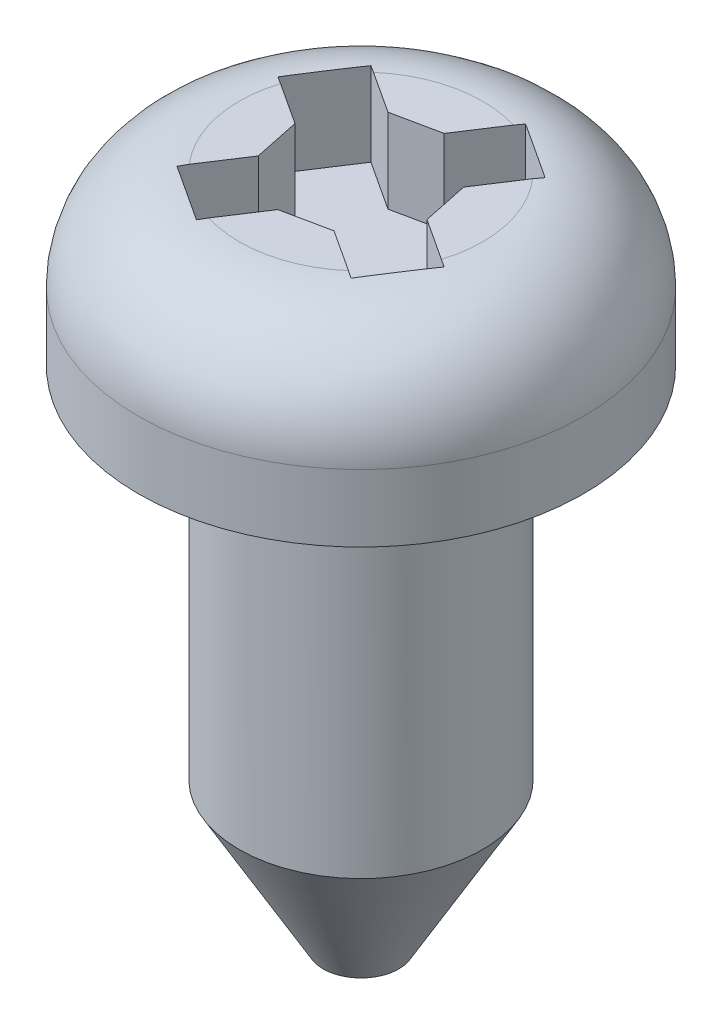
ISO-10303-21;
HEADER;
FILE_DESCRIPTION(('STEP AP214'),'2;1');
FILE_NAME('part.step','',(''),(''),'','','');
FILE_SCHEMA(('AUTOMOTIVE_DESIGN { 1 0 10303 214 1 1 1 1 }'));
ENDSEC;
DATA;
#1=APPLICATION_CONTEXT('core data for automotive mechanical design processes');
#2=APPLICATION_PROTOCOL_DEFINITION('international standard','automotive_design',2000,#1);
#3=PRODUCT_CONTEXT('',#1,'mechanical');
#4=PRODUCT('Part','Part','',(#3));
#5=PRODUCT_RELATED_PRODUCT_CATEGORY('part','',(#4));
#6=PRODUCT_DEFINITION_FORMATION('','',#4);
#7=PRODUCT_DEFINITION_CONTEXT('part definition',#1,'design');
#8=PRODUCT_DEFINITION('design','',#6,#7);
#9=PRODUCT_DEFINITION_SHAPE('','',#8);
#10=(LENGTH_UNIT() NAMED_UNIT(*) SI_UNIT(.MILLI.,.METRE.));
#11=(NAMED_UNIT(*) PLANE_ANGLE_UNIT() SI_UNIT($,.RADIAN.));
#12=(NAMED_UNIT(*) SI_UNIT($,.STERADIAN.) SOLID_ANGLE_UNIT());
#13=UNCERTAINTY_MEASURE_WITH_UNIT(LENGTH_MEASURE(1.E-05),#10,'distance_accuracy_value','');
#14=(GEOMETRIC_REPRESENTATION_CONTEXT(3) GLOBAL_UNCERTAINTY_ASSIGNED_CONTEXT((#13)) GLOBAL_UNIT_ASSIGNED_CONTEXT((#10,
#11,#12)) REPRESENTATION_CONTEXT('',''));
#15=CARTESIAN_POINT('',(0.,0.,0.));
#16=DIRECTION('',(0.,0.,1.));
#17=DIRECTION('',(1.,0.,0.));
#18=AXIS2_PLACEMENT_3D('',#15,#16,#17);
#19=CARTESIAN_POINT('',(-25.3042072060542,9.29457308248913,-5.11148706109274));
#20=DIRECTION('',(0.20522004133536,0.,0.978715860009591));
#21=DIRECTION('',(0.978715860009591,0.,-0.20522004133536));
#22=AXIS2_PLACEMENT_3D('',#19,#20,#21);
#23=PLANE('',#22);
#24=DIRECTION('',(0.,1.,0.));
#25=VECTOR('',#24,1.);
#26=CARTESIAN_POINT('',(-24.75056190888,9.29457308248913,-5.22757704738368));
#27=LINE('',#26,#25);
#28=CARTESIAN_POINT('',(-24.75056190888,10.2945730824891,-5.22757704738371));
#29=VERTEX_POINT('',#28);
#30=CARTESIAN_POINT('',(-24.75056190888,9.29457308248913,-5.22757704738367));
#31=VERTEX_POINT('',#30);
#32=EDGE_CURVE('E557',#29,#31,#27,.F.);
#33=ORIENTED_EDGE('',*,*,#32,.T.);
#34=DIRECTION('',(-0.978715860009593,0.,0.205220041335349));
#35=VECTOR('',#34,1.);
#36=CARTESIAN_POINT('',(-24.75056190888,9.29457308248913,-5.22757704738365));
#37=LINE('',#36,#35);
#38=CARTESIAN_POINT('',(-25.3042072060543,9.29457308248913,-5.1114870610928));
#39=VERTEX_POINT('',#38);
#40=EDGE_CURVE('E555',#31,#39,#37,.T.);
#41=ORIENTED_EDGE('',*,*,#40,.T.);
#42=DIRECTION('',(0.,1.,0.));
#43=VECTOR('',#42,1.);
#44=CARTESIAN_POINT('',(-25.3042072060543,9.29457308248913,-5.11148706109283));
#45=LINE('',#44,#43);
#46=CARTESIAN_POINT('',(-25.3042072060543,10.2945730824891,-5.11148706109279));
#47=VERTEX_POINT('',#46);
#48=EDGE_CURVE('E540',#39,#47,#45,.T.);
#49=ORIENTED_EDGE('',*,*,#48,.T.);
#50=DIRECTION('',(-0.978715860009565,0.,0.205220041335485));
#51=VECTOR('',#50,1.);
#52=CARTESIAN_POINT('',(-24.75056190888,10.2945730824891,-5.22757704738373));
#53=LINE('',#52,#51);
#54=EDGE_CURVE('E547',#29,#47,#53,.T.);
#55=ORIENTED_EDGE('',*,*,#54,.F.);
#56=EDGE_LOOP('',(#33,#41,#49,#55));
#57=FACE_BOUND('',#56,.T.);
#58=ADVANCED_FACE('F17',(#57),#23,.F.);
#59=CARTESIAN_POINT('',(-25.9739424895191,9.29457308248913,-5.54904237197589));
#60=DIRECTION('',(-0.978715860009591,0.,0.20522004133536));
#61=DIRECTION('',(0.20522004133536,0.,0.978715860009591));
#62=AXIS2_PLACEMENT_3D('',#59,#60,#61);
#63=PLANE('',#62);
#64=DIRECTION('',(0.,1.,0.));
#65=VECTOR('',#64,1.);
#66=CARTESIAN_POINT('',(-25.973942489519,9.29457308248913,-5.54904237197608));
#67=LINE('',#66,#65);
#68=CARTESIAN_POINT('',(-25.9739424895189,10.2945730824891,-5.54904237197606));
#69=VERTEX_POINT('',#68);
#70=CARTESIAN_POINT('',(-25.973942489519,9.29457308248913,-5.54904237197602));
#71=VERTEX_POINT('',#70);
#72=EDGE_CURVE('E140',#69,#71,#67,.F.);
#73=ORIENTED_EDGE('',*,*,#72,.T.);
#74=DIRECTION('',(-0.205220041335355,0.,-0.978715860009592));
#75=VECTOR('',#74,1.);
#76=CARTESIAN_POINT('',(-25.9739424895191,9.29457308248913,-5.54904237197589));
#77=LINE('',#76,#75);
#78=CARTESIAN_POINT('',(-26.09003247581,9.29457308248913,-6.10268766915));
#79=VERTEX_POINT('',#78);
#80=EDGE_CURVE('E133',#71,#79,#77,.T.);
#81=ORIENTED_EDGE('',*,*,#80,.T.);
#82=DIRECTION('',(0.,1.,0.));
#83=VECTOR('',#82,1.);
#84=CARTESIAN_POINT('',(-26.09003247581,9.29457308248913,-6.10268766915));
#85=LINE('',#84,#83);
#86=CARTESIAN_POINT('',(-26.09003247581,10.2945730824891,-6.10268766915001));
#87=VERTEX_POINT('',#86);
#88=EDGE_CURVE('E476',#79,#87,#85,.T.);
#89=ORIENTED_EDGE('',*,*,#88,.T.);
#90=DIRECTION('',(-0.205220041335553,0.,-0.978715860009551));
#91=VECTOR('',#90,1.);
#92=CARTESIAN_POINT('',(-25.9739424895189,10.2945730824891,-5.54904237197605));
#93=LINE('',#92,#91);
#94=EDGE_CURVE('E642',#69,#87,#93,.T.);
#95=ORIENTED_EDGE('',*,*,#94,.F.);
#96=EDGE_LOOP('',(#73,#81,#89,#95));
#97=FACE_BOUND('',#96,.T.);
#98=ADVANCED_FACE('F239',(#97),#63,.F.);
#99=CARTESIAN_POINT('',(-25.0988318677528,9.29457308248913,-6.88851293890572));
#100=DIRECTION('',(-0.20522004133536,0.,-0.978715860009591));
#101=DIRECTION('',(-0.978715860009591,0.,0.20522004133536));
#102=AXIS2_PLACEMENT_3D('',#99,#100,#101);
#103=PLANE('',#102);
#104=DIRECTION('',(0.,1.,0.));
#105=VECTOR('',#104,1.);
#106=CARTESIAN_POINT('',(-25.6524771649268,9.29457308248913,-6.77242295261503));
#107=LINE('',#106,#105);
#108=CARTESIAN_POINT('',(-25.6524771649268,10.2945730824891,-6.77242295261503));
#109=VERTEX_POINT('',#108);
#110=CARTESIAN_POINT('',(-25.6524771649268,9.29457308248913,-6.77242295261503));
#111=VERTEX_POINT('',#110);
#112=EDGE_CURVE('E628',#109,#111,#107,.F.);
#113=ORIENTED_EDGE('',*,*,#112,.T.);
#114=DIRECTION('',(0.978715860009657,0.,-0.205220041335045));
#115=VECTOR('',#114,1.);
#116=CARTESIAN_POINT('',(-25.6524771649268,9.29457308248913,-6.77242295261503));
#117=LINE('',#116,#115);
#118=CARTESIAN_POINT('',(-25.0988318677527,9.29457308248913,-6.88851293890568));
#119=VERTEX_POINT('',#118);
#120=EDGE_CURVE('E598',#111,#119,#117,.T.);
#121=ORIENTED_EDGE('',*,*,#120,.T.);
#122=DIRECTION('',(0.,1.,0.));
#123=VECTOR('',#122,1.);
#124=CARTESIAN_POINT('',(-25.0988318677527,9.29457308248913,-6.88851293890567));
#125=LINE('',#124,#123);
#126=CARTESIAN_POINT('',(-25.0988318677527,10.2945730824891,-6.88851293890576));
#127=VERTEX_POINT('',#126);
#128=EDGE_CURVE('E392',#119,#127,#125,.T.);
#129=ORIENTED_EDGE('',*,*,#128,.T.);
#130=DIRECTION('',(0.978715860009579,0.,-0.205220041335414));
#131=VECTOR('',#130,1.);
#132=CARTESIAN_POINT('',(-25.6524771649268,10.2945730824891,-6.77242295261503));
#133=LINE('',#132,#131);
#134=EDGE_CURVE('E412',#109,#127,#133,.T.);
#135=ORIENTED_EDGE('',*,*,#134,.F.);
#136=EDGE_LOOP('',(#113,#121,#129,#135));
#137=FACE_BOUND('',#136,.T.);
#138=ADVANCED_FACE('F236',(#137),#103,.F.);
#139=CARTESIAN_POINT('',(-24.4290965842875,9.29457308248913,-6.45095762802289));
#140=DIRECTION('',(0.978715860009591,0.,-0.20522004133536));
#141=DIRECTION('',(-0.20522004133536,0.,-0.978715860009591));
#142=AXIS2_PLACEMENT_3D('',#139,#140,#141);
#143=PLANE('',#142);
#144=DIRECTION('',(0.,1.,0.));
#145=VECTOR('',#144,1.);
#146=CARTESIAN_POINT('',(-24.4290965842875,9.29457308248913,-6.4509576280229));
#147=LINE('',#146,#145);
#148=CARTESIAN_POINT('',(-24.4290965842875,10.2945730824891,-6.45095762802289));
#149=VERTEX_POINT('',#148);
#150=CARTESIAN_POINT('',(-24.4290965842875,9.29457308248913,-6.4509576280229));
#151=VERTEX_POINT('',#150);
#152=EDGE_CURVE('E601',#149,#151,#147,.F.);
#153=ORIENTED_EDGE('',*,*,#152,.T.);
#154=DIRECTION('',(0.205220041335026,0.,0.978715860009661));
#155=VECTOR('',#154,1.);
#156=CARTESIAN_POINT('',(-24.4290965842875,9.29457308248913,-6.45095762802289));
#157=LINE('',#156,#155);
#158=CARTESIAN_POINT('',(-24.3130065979968,9.29457308248913,-5.89731233084878));
#159=VERTEX_POINT('',#158);
#160=EDGE_CURVE('E558',#151,#159,#157,.T.);
#161=ORIENTED_EDGE('',*,*,#160,.T.);
#162=DIRECTION('',(0.,1.,0.));
#163=VECTOR('',#162,1.);
#164=CARTESIAN_POINT('',(-24.3130065979968,9.29457308248913,-5.89731233084878));
#165=LINE('',#164,#163);
#166=CARTESIAN_POINT('',(-24.3130065979968,10.2945730824891,-5.89731233084878));
#167=VERTEX_POINT('',#166);
#168=EDGE_CURVE('E593',#159,#167,#165,.T.);
#169=ORIENTED_EDGE('',*,*,#168,.T.);
#170=DIRECTION('',(0.205220041335019,0.,0.978715860009662));
#171=VECTOR('',#170,1.);
#172=CARTESIAN_POINT('',(-24.4290965842875,10.2945730824891,-6.45095762802289));
#173=LINE('',#172,#171);
#174=EDGE_CURVE('E329',#149,#167,#173,.T.);
#175=ORIENTED_EDGE('',*,*,#174,.F.);
#176=EDGE_LOOP('',(#153,#161,#169,#175));
#177=FACE_BOUND('',#176,.T.);
#178=ADVANCED_FACE('F233',(#177),#143,.F.);
#179=CARTESIAN_POINT('',(-25.0854295506126,9.29457308248913,-5.44635470282528));
#180=DIRECTION('',(0.,-1.,0.));
#181=DIRECTION('',(0.,0.,-1.));
#182=AXIS2_PLACEMENT_3D('',#179,#180,#181);
#183=PLANE('',#182);
#184=ORIENTED_EDGE('',*,*,#40,.F.);
#185=DIRECTION('',(0.837169104331223,0.,0.546944138603988));
#186=VECTOR('',#185,1.);
#187=CARTESIAN_POINT('',(-24.75056190888,9.29457308248913,-5.22757704738365));
#188=LINE('',#187,#186);
#189=CARTESIAN_POINT('',(-24.1645435358481,9.29457308248913,-4.84471615036077));
#190=VERTEX_POINT('',#189);
#191=EDGE_CURVE('E562',#31,#190,#188,.T.);
#192=ORIENTED_EDGE('',*,*,#191,.T.);
#193=DIRECTION('',(0.546944138603986,0.,-0.837169104331224));
#194=VECTOR('',#193,1.);
#195=CARTESIAN_POINT('',(-24.1645435358479,9.29457308248913,-4.84471615036108));
#196=LINE('',#195,#194);
#197=CARTESIAN_POINT('',(-23.7269882249649,9.29457308248913,-5.51445143382579));
#198=VERTEX_POINT('',#197);
#199=EDGE_CURVE('E173',#190,#198,#196,.T.);
#200=ORIENTED_EDGE('',*,*,#199,.T.);
#201=DIRECTION('',(-0.837169104331223,0.,-0.546944138603988));
#202=VECTOR('',#201,1.);
#203=CARTESIAN_POINT('',(-24.3130065979968,9.29457308248913,-5.89731233084878));
#204=LINE('',#203,#202);
#205=EDGE_CURVE('E216',#198,#159,#204,.T.);
#206=ORIENTED_EDGE('',*,*,#205,.T.);
#207=ORIENTED_EDGE('',*,*,#160,.F.);
#208=DIRECTION('',(0.546944138603991,0.,-0.837169104331221));
#209=VECTOR('',#208,1.);
#210=CARTESIAN_POINT('',(-24.0462356872648,9.29457308248913,-7.03697600105463));
#211=LINE('',#210,#209);
#212=CARTESIAN_POINT('',(-24.0462356872648,9.29457308248913,-7.0369760010546));
#213=VERTEX_POINT('',#212);
#214=EDGE_CURVE('E603',#151,#213,#211,.T.);
#215=ORIENTED_EDGE('',*,*,#214,.T.);
#216=DIRECTION('',(-0.837169104331221,0.,-0.546944138603991));
#217=VECTOR('',#216,1.);
#218=CARTESIAN_POINT('',(-24.7159709707298,9.29457308248913,-7.47453131193772));
#219=LINE('',#218,#217);
#220=CARTESIAN_POINT('',(-24.7159709707298,9.29457308248913,-7.47453131193772));
#221=VERTEX_POINT('',#220);
#222=EDGE_CURVE('E391',#213,#221,#219,.T.);
#223=ORIENTED_EDGE('',*,*,#222,.T.);
#224=DIRECTION('',(-0.54694413860399,0.,0.837169104331221));
#225=VECTOR('',#224,1.);
#226=CARTESIAN_POINT('',(-24.7159709707298,9.29457308248913,-7.47453131193772));
#227=LINE('',#226,#225);
#228=EDGE_CURVE('E613',#221,#119,#227,.T.);
#229=ORIENTED_EDGE('',*,*,#228,.T.);
#230=ORIENTED_EDGE('',*,*,#120,.F.);
#231=DIRECTION('',(-0.837169104331223,0.,-0.546944138603988));
#232=VECTOR('',#231,1.);
#233=CARTESIAN_POINT('',(-25.6524771649268,9.29457308248913,-6.77242295261503));
#234=LINE('',#233,#232);
#235=CARTESIAN_POINT('',(-26.2384955379586,9.29457308248913,-7.15528384963779));
#236=VERTEX_POINT('',#235);
#237=EDGE_CURVE('E630',#111,#236,#234,.T.);
#238=ORIENTED_EDGE('',*,*,#237,.T.);
#239=DIRECTION('',(-0.546944138603986,0.,0.837169104331224));
#240=VECTOR('',#239,1.);
#241=CARTESIAN_POINT('',(-26.6760508488417,9.29457308248913,-6.48554856617292));
#242=LINE('',#241,#240);
#243=CARTESIAN_POINT('',(-26.6760508488417,9.29457308248913,-6.48554856617287));
#244=VERTEX_POINT('',#243);
#245=EDGE_CURVE('E475',#236,#244,#242,.T.);
#246=ORIENTED_EDGE('',*,*,#245,.T.);
#247=DIRECTION('',(0.837169104331223,0.,0.546944138603988));
#248=VECTOR('',#247,1.);
#249=CARTESIAN_POINT('',(-26.09003247581,9.29457308248913,-6.10268766915));
#250=LINE('',#249,#248);
#251=EDGE_CURVE('E640',#244,#79,#250,.T.);
#252=ORIENTED_EDGE('',*,*,#251,.T.);
#253=ORIENTED_EDGE('',*,*,#80,.F.);
#254=DIRECTION('',(-0.546944138603991,0.,0.837169104331221));
#255=VECTOR('',#254,1.);
#256=CARTESIAN_POINT('',(-26.3568033865419,9.29457308248913,-4.96302399894399));
#257=LINE('',#256,#255);
#258=CARTESIAN_POINT('',(-26.3568033865419,9.29457308248913,-4.96302399894399));
#259=VERTEX_POINT('',#258);
#260=EDGE_CURVE('E516',#71,#259,#257,.T.);
#261=ORIENTED_EDGE('',*,*,#260,.T.);
#262=DIRECTION('',(0.837169104331221,0.,0.546944138603991));
#263=VECTOR('',#262,1.);
#264=CARTESIAN_POINT('',(-26.3568033865419,9.29457308248913,-4.96302399894399));
#265=LINE('',#264,#263);
#266=CARTESIAN_POINT('',(-25.6870681030771,9.29457308248913,-4.52546868806095));
#267=VERTEX_POINT('',#266);
#268=EDGE_CURVE('E520',#259,#267,#265,.T.);
#269=ORIENTED_EDGE('',*,*,#268,.T.);
#270=DIRECTION('',(0.54694413860399,0.,-0.837169104331221));
#271=VECTOR('',#270,1.);
#272=CARTESIAN_POINT('',(-25.6870681030772,9.29457308248913,-4.52546868806087));
#273=LINE('',#272,#271);
#274=EDGE_CURVE('E543',#267,#39,#273,.T.);
#275=ORIENTED_EDGE('',*,*,#274,.T.);
#276=EDGE_LOOP('',(#184,#192,#200,#206,#207,#215,#223,#229,#230,#238,#246,#252,#253,#261,#269,#275));
#277=FACE_BOUND('',#276,.T.);
#278=ADVANCED_FACE('F228',(#277),#183,.F.);
#279=CARTESIAN_POINT('',(-24.75056190888,9.29457308248913,-5.22757704738365));
#280=DIRECTION('',(-0.546944138603988,0.,0.837169104331223));
#281=DIRECTION('',(0.837169104331223,0.,0.546944138603988));
#282=AXIS2_PLACEMENT_3D('',#279,#280,#281);
#283=PLANE('',#282);
#284=DIRECTION('',(0.,1.,0.));
#285=VECTOR('',#284,1.);
#286=CARTESIAN_POINT('',(-24.1645435358481,9.29457308248913,-4.84471615036075));
#287=LINE('',#286,#285);
#288=CARTESIAN_POINT('',(-24.1645435358481,10.290194536761,-4.84471615036081));
#289=VERTEX_POINT('',#288);
#290=EDGE_CURVE('E190',#289,#190,#287,.F.);
#291=ORIENTED_EDGE('',*,*,#290,.T.);
#292=ORIENTED_EDGE('',*,*,#191,.F.);
#293=ORIENTED_EDGE('',*,*,#32,.F.);
#294=DIRECTION('',(-0.837169104331162,0.,-0.546944138604081));
#295=VECTOR('',#294,1.);
#296=CARTESIAN_POINT('',(-24.2535044848721,10.2945730824891,-4.90283662970197));
#297=LINE('',#296,#295);
#298=CARTESIAN_POINT('',(-24.2535044848721,10.2945730824891,-4.90283662970197));
#299=VERTEX_POINT('',#298);
#300=EDGE_CURVE('E198',#299,#29,#297,.T.);
#301=ORIENTED_EDGE('',*,*,#300,.F.);
#302=CARTESIAN_POINT('',(-24.1645435358482,10.290194536761,-4.84471615036087));
#303=CARTESIAN_POINT('',(-24.2088309172075,10.2945730824891,-4.87365023730133));
#304=CARTESIAN_POINT('',(-24.2535044848721,10.2945730824891,-4.90283662970197));
#305=B_SPLINE_CURVE_WITH_KNOTS('',2,(#302,#303,#304),.UNSPECIFIED.,.F.,.F.,(3,3),(0.,1.),.UNSPECIFIED.);
#306=EDGE_CURVE('E183',#289,#299,#305,.T.);
#307=ORIENTED_EDGE('',*,*,#306,.F.);
#308=EDGE_LOOP('',(#291,#292,#293,#301,#307));
#309=FACE_BOUND('',#308,.T.);
#310=ADVANCED_FACE('F196',(#309),#283,.F.);
#311=CARTESIAN_POINT('',(-25.2015195369034,10.2945730824891,-5.99999999999937));
#312=DIRECTION('',(0.,1.,0.));
#313=DIRECTION('',(0.,0.,1.));
#314=AXIS2_PLACEMENT_3D('',#311,#312,#313);
#315=PLANE('',#314);
#316=ORIENTED_EDGE('',*,*,#300,.T.);
#317=ORIENTED_EDGE('',*,*,#54,.T.);
#318=DIRECTION('',(0.54694413860399,0.,-0.837169104331221));
#319=VECTOR('',#318,1.);
#320=CARTESIAN_POINT('',(-25.6870681030772,10.2945730824891,-4.52546868806087));
#321=LINE('',#320,#319);
#322=CARTESIAN_POINT('',(-25.6289476237358,10.2945730824891,-4.61442963708493));
#323=VERTEX_POINT('',#322);
#324=EDGE_CURVE('E80',#47,#323,#321,.F.);
#325=ORIENTED_EDGE('',*,*,#324,.T.);
#326=CARTESIAN_POINT('',(-25.2015195369034,10.2945730824892,-5.99999999999937));
#327=DIRECTION('',(0.,-1.,0.));
#328=DIRECTION('',(0.653803484159476,0.,0.756664393308506));
#329=AXIS2_PLACEMENT_3D('',#326,#327,#328);
#330=CIRCLE('',#329,1.45000000000009);
#331=EDGE_CURVE('E199',#299,#323,#330,.T.);
#332=ORIENTED_EDGE('',*,*,#331,.F.);
#333=EDGE_LOOP('',(#316,#317,#325,#332));
#334=FACE_BOUND('',#333,.T.);
#335=ADVANCED_FACE('F227',(#334),#315,.T.);
#336=CARTESIAN_POINT('',(-25.6870681030772,9.29457308248913,-4.52546868806087));
#337=DIRECTION('',(0.837169104331221,0.,0.54694413860399));
#338=DIRECTION('',(0.54694413860399,0.,-0.837169104331221));
#339=AXIS2_PLACEMENT_3D('',#336,#337,#338);
#340=PLANE('',#339);
#341=ORIENTED_EDGE('',*,*,#324,.F.);
#342=ORIENTED_EDGE('',*,*,#48,.F.);
#343=ORIENTED_EDGE('',*,*,#274,.F.);
#344=DIRECTION('',(0.,1.,0.));
#345=VECTOR('',#344,1.);
#346=CARTESIAN_POINT('',(-25.6870681030771,9.29457308248913,-4.52546868806095));
#347=LINE('',#346,#345);
#348=CARTESIAN_POINT('',(-25.6870681030771,10.2901945367611,-4.52546868806095));
#349=VERTEX_POINT('',#348);
#350=EDGE_CURVE('E71',#267,#349,#347,.T.);
#351=ORIENTED_EDGE('',*,*,#350,.T.);
#352=CARTESIAN_POINT('',(-25.6289476237359,10.2945730824891,-4.61442963708504));
#353=CARTESIAN_POINT('',(-25.6581340161347,10.2945730824891,-4.56975606942327));
#354=CARTESIAN_POINT('',(-25.6870681030772,10.2901945367611,-4.52546868806087));
#355=B_SPLINE_CURVE_WITH_KNOTS('',2,(#352,#353,#354),.UNSPECIFIED.,.F.,.F.,(3,3),(0.,1.),.UNSPECIFIED.);
#356=EDGE_CURVE('E201',#323,#349,#355,.T.);
#357=ORIENTED_EDGE('',*,*,#356,.F.);
#358=EDGE_LOOP('',(#341,#342,#343,#351,#357));
#359=FACE_BOUND('',#358,.T.);
#360=ADVANCED_FACE('F526',(#359),#340,.F.);
#361=CARTESIAN_POINT('',(-26.3568033865419,9.29457308248913,-4.96302399894399));
#362=DIRECTION('',(-0.546944138603991,0.,0.837169104331221));
#363=DIRECTION('',(0.837169104331221,0.,0.546944138603991));
#364=AXIS2_PLACEMENT_3D('',#361,#362,#363);
#365=PLANE('',#364);
#366=ORIENTED_EDGE('',*,*,#350,.F.);
#367=ORIENTED_EDGE('',*,*,#268,.F.);
#368=DIRECTION('',(0.,1.,0.));
#369=VECTOR('',#368,1.);
#370=CARTESIAN_POINT('',(-26.3568033865419,9.29457308248913,-4.96302399894399));
#371=LINE('',#370,#369);
#372=CARTESIAN_POINT('',(-26.3568033865419,10.290194536761,-4.96302399894397));
#373=VERTEX_POINT('',#372);
#374=EDGE_CURVE('E509',#259,#373,#371,.T.);
#375=ORIENTED_EDGE('',*,*,#374,.T.);
#376=CARTESIAN_POINT('',(-25.6870681030771,10.2901945367611,-4.52546868806095));
#377=CARTESIAN_POINT('',(-25.7149703432695,10.2909269774353,-4.5436979402493));
#378=CARTESIAN_POINT('',(-25.7428750431685,10.2914873019811,-4.5619287994273));
#379=CARTESIAN_POINT('',(-25.7986865329913,10.2923586930538,-4.59839188325039));
#380=CARTESIAN_POINT('',(-25.8265933228405,10.2926697661586,-4.61662410784675));
#381=CARTESIAN_POINT('',(-25.9103112565686,10.2933715731058,-4.6713191902521));
#382=CARTESIAN_POINT('',(-25.9661235006891,10.2935309633173,-4.70778276687728));
#383=CARTESIAN_POINT('',(-26.07774798893,10.2935309633173,-4.78070992012765));
#384=CARTESIAN_POINT('',(-26.1335602330504,10.2933715731058,-4.81717349675283));
#385=CARTESIAN_POINT('',(-26.2172781667785,10.2926697661586,-4.87186857915818));
#386=CARTESIAN_POINT('',(-26.2451849566277,10.2923586930538,-4.89010080375454));
#387=CARTESIAN_POINT('',(-26.3009964464506,10.2914873019811,-4.92656388757764));
#388=CARTESIAN_POINT('',(-26.3289011463495,10.2909269774353,-4.94479474675564));
#389=CARTESIAN_POINT('',(-26.3568033865419,10.2901945367611,-4.96302399894399));
#390=B_SPLINE_CURVE_WITH_KNOTS('',3,(#376,#377,#378,#379,#380,#381,#382,#383,#384,#385,#386,
#387,#388,#389),.UNSPECIFIED.,.F.,.F.,(4,2,2,2,2,2,4),(0.,0.100010330135586,0.200018020854283,
0.4000207298462,0.600023438838118,0.700031129556812,0.800041459692404),.UNSPECIFIED.);
#391=EDGE_CURVE('E675',#349,#373,#390,.T.);
#392=ORIENTED_EDGE('',*,*,#391,.F.);
#393=EDGE_LOOP('',(#366,#367,#375,#392));
#394=FACE_BOUND('',#393,.T.);
#395=ADVANCED_FACE('F503',(#394),#365,.F.);
#396=CARTESIAN_POINT('',(-26.3568033865419,9.29457308248913,-4.96302399894399));
#397=DIRECTION('',(-0.837169104331221,0.,-0.546944138603991));
#398=DIRECTION('',(-0.546944138603991,0.,0.837169104331221));
#399=AXIS2_PLACEMENT_3D('',#396,#397,#398);
#400=PLANE('',#399);
#401=ORIENTED_EDGE('',*,*,#374,.F.);
#402=ORIENTED_EDGE('',*,*,#260,.F.);
#403=ORIENTED_EDGE('',*,*,#72,.F.);
#404=DIRECTION('',(0.546944138603959,0.,-0.837169104331242));
#405=VECTOR('',#404,1.);
#406=CARTESIAN_POINT('',(-26.2986829072005,10.2945730824891,-5.05198494796823));
#407=LINE('',#406,#405);
#408=CARTESIAN_POINT('',(-26.2986829072005,10.2945730824891,-5.05198494796824));
#409=VERTEX_POINT('',#408);
#410=EDGE_CURVE('E488',#409,#69,#407,.T.);
#411=ORIENTED_EDGE('',*,*,#410,.F.);
#412=CARTESIAN_POINT('',(-26.3568033865419,10.290194536761,-4.96302399894397));
#413=CARTESIAN_POINT('',(-26.3278692995994,10.2945730824891,-5.00731138030639));
#414=CARTESIAN_POINT('',(-26.2986829072006,10.2945730824891,-5.05198494796828));
#415=B_SPLINE_CURVE_WITH_KNOTS('',2,(#412,#413,#414),.UNSPECIFIED.,.F.,.F.,(3,3),(0.,1.),.UNSPECIFIED.);
#416=EDGE_CURVE('E460',#373,#409,#415,.T.);
#417=ORIENTED_EDGE('',*,*,#416,.F.);
#418=EDGE_LOOP('',(#401,#402,#403,#411,#417));
#419=FACE_BOUND('',#418,.T.);
#420=ADVANCED_FACE('F499',(#419),#400,.F.);
#421=CARTESIAN_POINT('',(-25.2015195369034,10.2945730824891,-5.99999999999937));
#422=DIRECTION('',(0.,1.,0.));
#423=DIRECTION('',(0.,0.,1.));
#424=AXIS2_PLACEMENT_3D('',#421,#422,#423);
#425=PLANE('',#424);
#426=DIRECTION('',(0.837169104331223,0.,0.546944138603988));
#427=VECTOR('',#426,1.);
#428=CARTESIAN_POINT('',(-26.09003247581,10.2945730824891,-6.10268766915));
#429=LINE('',#428,#427);
#430=CARTESIAN_POINT('',(-26.5870898998178,10.2945730824891,-6.4274280868317));
#431=VERTEX_POINT('',#430);
#432=EDGE_CURVE('E468',#87,#431,#429,.F.);
#433=ORIENTED_EDGE('',*,*,#432,.T.);
#434=CARTESIAN_POINT('',(-25.2015195369034,10.2945730824892,-5.99999999999937));
#435=DIRECTION('',(0.,-1.,0.));
#436=DIRECTION('',(-0.756664393308472,0.,0.653803484159516));
#437=AXIS2_PLACEMENT_3D('',#434,#435,#436);
#438=CIRCLE('',#437,1.44999999999976);
#439=EDGE_CURVE('E459',#409,#431,#438,.T.);
#440=ORIENTED_EDGE('',*,*,#439,.F.);
#441=ORIENTED_EDGE('',*,*,#410,.T.);
#442=ORIENTED_EDGE('',*,*,#94,.T.);
#443=EDGE_LOOP('',(#433,#440,#441,#442));
#444=FACE_BOUND('',#443,.T.);
#445=ADVANCED_FACE('F490',(#444),#425,.T.);
#446=CARTESIAN_POINT('',(-26.09003247581,9.29457308248913,-6.10268766915));
#447=DIRECTION('',(-0.546944138603988,0.,0.837169104331223));
#448=DIRECTION('',(0.837169104331223,0.,0.546944138603988));
#449=AXIS2_PLACEMENT_3D('',#446,#447,#448);
#450=PLANE('',#449);
#451=ORIENTED_EDGE('',*,*,#432,.F.);
#452=ORIENTED_EDGE('',*,*,#88,.F.);
#453=ORIENTED_EDGE('',*,*,#251,.F.);
#454=DIRECTION('',(0.,1.,0.));
#455=VECTOR('',#454,1.);
#456=CARTESIAN_POINT('',(-26.6760508488417,9.29457308248913,-6.48554856617292));
#457=LINE('',#456,#455);
#458=CARTESIAN_POINT('',(-26.6760508488417,10.2901945367611,-6.4855485661729));
#459=VERTEX_POINT('',#458);
#460=EDGE_CURVE('E631',#244,#459,#457,.T.);
#461=ORIENTED_EDGE('',*,*,#460,.T.);
#462=CARTESIAN_POINT('',(-26.5870898998179,10.2945730824891,-6.42742808683166));
#463=CARTESIAN_POINT('',(-26.6317634674796,10.2945730824891,-6.45661447923041));
#464=CARTESIAN_POINT('',(-26.6760508488418,10.2901945367611,-6.48554856617276));
#465=B_SPLINE_CURVE_WITH_KNOTS('',2,(#462,#463,#464),.UNSPECIFIED.,.F.,.F.,(3,3),(0.,1.),.UNSPECIFIED.);
#466=EDGE_CURVE('E455',#431,#459,#465,.T.);
#467=ORIENTED_EDGE('',*,*,#466,.F.);
#468=EDGE_LOOP('',(#451,#452,#453,#461,#467));
#469=FACE_BOUND('',#468,.T.);
#470=ADVANCED_FACE('F443',(#469),#450,.F.);
#471=CARTESIAN_POINT('',(-26.6760508488417,9.29457308248913,-6.48554856617292));
#472=DIRECTION('',(-0.837169104331224,0.,-0.546944138603986));
#473=DIRECTION('',(-0.546944138603986,0.,0.837169104331224));
#474=AXIS2_PLACEMENT_3D('',#471,#472,#473);
#475=PLANE('',#474);
#476=CARTESIAN_POINT('',(-26.6760508488417,10.2901945367611,-6.48554856617289));
#477=CARTESIAN_POINT('',(-26.6578215966534,10.2909269774353,-6.51345080636529));
#478=CARTESIAN_POINT('',(-26.6395907374754,10.2914873019811,-6.54135550626424));
#479=CARTESIAN_POINT('',(-26.6031276536523,10.2923586930538,-6.59716699608704));
#480=CARTESIAN_POINT('',(-26.5848954290559,10.2926697661586,-6.6250737859363));
#481=CARTESIAN_POINT('',(-26.5302003466505,10.2933715731058,-6.70879171966438));
#482=CARTESIAN_POINT('',(-26.4937367700254,10.2935309633173,-6.76460396378484));
#483=CARTESIAN_POINT('',(-26.420809616775,10.2935309633173,-6.87622845202578));
#484=CARTESIAN_POINT('',(-26.3843460401498,10.2933715731058,-6.93204069614626));
#485=CARTESIAN_POINT('',(-26.3296509577444,10.2926697661586,-7.01575862987436));
#486=CARTESIAN_POINT('',(-26.311418733148,10.2923586930539,-7.04366541972362));
#487=CARTESIAN_POINT('',(-26.2749556493249,10.2914873019811,-7.09947690954644));
#488=CARTESIAN_POINT('',(-26.2567247901469,10.2909269774353,-7.1273816094454));
#489=CARTESIAN_POINT('',(-26.2384955379586,10.2901945367611,-7.1552838496378));
#490=B_SPLINE_CURVE_WITH_KNOTS('',3,(#476,#477,#478,#479,#480,#481,#482,#483,#484,#485,#486,
#487,#488,#489),.UNSPECIFIED.,.F.,.F.,(4,2,2,2,2,2,4),(0.,0.100010330135601,0.200018020854314,
0.400020729846256,0.600023438838246,0.700031129556977,0.800041459692601),.UNSPECIFIED.);
#491=CARTESIAN_POINT('',(-26.2384955379586,10.290194536761,-7.1552838496378));
#492=VERTEX_POINT('',#491);
#493=EDGE_CURVE('E448',#459,#492,#490,.T.);
#494=ORIENTED_EDGE('',*,*,#493,.F.);
#495=ORIENTED_EDGE('',*,*,#460,.F.);
#496=ORIENTED_EDGE('',*,*,#245,.F.);
#497=DIRECTION('',(0.,1.,0.));
#498=VECTOR('',#497,1.);
#499=CARTESIAN_POINT('',(-26.2384955379586,9.29457308248913,-7.1552838496378));
#500=LINE('',#499,#498);
#501=EDGE_CURVE('E413',#236,#492,#500,.T.);
#502=ORIENTED_EDGE('',*,*,#501,.T.);
#503=EDGE_LOOP('',(#494,#495,#496,#502));
#504=FACE_BOUND('',#503,.T.);
#505=ADVANCED_FACE('F438',(#504),#475,.F.);
#506=CARTESIAN_POINT('',(-25.6524771649268,9.29457308248913,-6.77242295261503));
#507=DIRECTION('',(0.546944138603988,0.,-0.837169104331223));
#508=DIRECTION('',(-0.837169104331223,0.,-0.546944138603988));
#509=AXIS2_PLACEMENT_3D('',#506,#507,#508);
#510=PLANE('',#509);
#511=ORIENTED_EDGE('',*,*,#501,.F.);
#512=ORIENTED_EDGE('',*,*,#237,.F.);
#513=ORIENTED_EDGE('',*,*,#112,.F.);
#514=DIRECTION('',(0.837169104331258,0.,0.546944138603933));
#515=VECTOR('',#514,1.);
#516=CARTESIAN_POINT('',(-26.1495345889347,10.2945730824891,-7.09716337029666));
#517=LINE('',#516,#515);
#518=CARTESIAN_POINT('',(-26.1495345889347,10.2945730824891,-7.09716337029667));
#519=VERTEX_POINT('',#518);
#520=EDGE_CURVE('E405',#519,#109,#517,.T.);
#521=ORIENTED_EDGE('',*,*,#520,.F.);
#522=CARTESIAN_POINT('',(-26.2384955379586,10.290194536761,-7.1552838496378));
#523=CARTESIAN_POINT('',(-26.1942081565993,10.2945730824891,-7.12634976269731));
#524=CARTESIAN_POINT('',(-26.1495345889347,10.2945730824891,-7.09716337029669));
#525=B_SPLINE_CURVE_WITH_KNOTS('',2,(#522,#523,#524),.UNSPECIFIED.,.F.,.F.,(3,3),(0.,1.),.UNSPECIFIED.);
#526=EDGE_CURVE('E454',#492,#519,#525,.T.);
#527=ORIENTED_EDGE('',*,*,#526,.F.);
#528=EDGE_LOOP('',(#511,#512,#513,#521,#527));
#529=FACE_BOUND('',#528,.T.);
#530=ADVANCED_FACE('F429',(#529),#510,.F.);
#531=CARTESIAN_POINT('',(-25.2015195369034,10.2945730824891,-5.99999999999937));
#532=DIRECTION('',(0.,1.,0.));
#533=DIRECTION('',(0.,0.,1.));
#534=AXIS2_PLACEMENT_3D('',#531,#532,#533);
#535=PLANE('',#534);
#536=DIRECTION('',(-0.54694413860399,0.,0.837169104331221));
#537=VECTOR('',#536,1.);
#538=CARTESIAN_POINT('',(-24.7159709707298,10.2945730824891,-7.47453131193772));
#539=LINE('',#538,#537);
#540=CARTESIAN_POINT('',(-24.7740914500711,10.2945730824891,-7.38557036291365));
#541=VERTEX_POINT('',#540);
#542=EDGE_CURVE('E384',#127,#541,#539,.F.);
#543=ORIENTED_EDGE('',*,*,#542,.T.);
#544=CARTESIAN_POINT('',(-25.2015195369034,10.2945730824892,-5.99999999999937));
#545=DIRECTION('',(0.,-1.,0.));
#546=DIRECTION('',(-0.653803484159513,0.,-0.756664393308474));
#547=AXIS2_PLACEMENT_3D('',#544,#545,#546);
#548=CIRCLE('',#547,1.45);
#549=EDGE_CURVE('E400',#519,#541,#548,.T.);
#550=ORIENTED_EDGE('',*,*,#549,.F.);
#551=ORIENTED_EDGE('',*,*,#520,.T.);
#552=ORIENTED_EDGE('',*,*,#134,.T.);
#553=EDGE_LOOP('',(#543,#550,#551,#552));
#554=FACE_BOUND('',#553,.T.);
#555=ADVANCED_FACE('F374',(#554),#535,.T.);
#556=CARTESIAN_POINT('',(-24.7159709707298,9.29457308248913,-7.47453131193772));
#557=DIRECTION('',(-0.837169104331221,0.,-0.54694413860399));
#558=DIRECTION('',(-0.54694413860399,0.,0.837169104331221));
#559=AXIS2_PLACEMENT_3D('',#556,#557,#558);
#560=PLANE('',#559);
#561=ORIENTED_EDGE('',*,*,#542,.F.);
#562=ORIENTED_EDGE('',*,*,#128,.F.);
#563=ORIENTED_EDGE('',*,*,#228,.F.);
#564=DIRECTION('',(0.,1.,0.));
#565=VECTOR('',#564,1.);
#566=CARTESIAN_POINT('',(-24.7159709707298,9.29457308248913,-7.47453131193772));
#567=LINE('',#566,#565);
#568=CARTESIAN_POINT('',(-24.7159709707299,10.2901945367611,-7.47453131193778));
#569=VERTEX_POINT('',#568);
#570=EDGE_CURVE('E604',#221,#569,#567,.T.);
#571=ORIENTED_EDGE('',*,*,#570,.T.);
#572=CARTESIAN_POINT('',(-24.774091450071,10.2945730824891,-7.38557036291359));
#573=CARTESIAN_POINT('',(-24.7449050576722,10.2945730824891,-7.43024393057549));
#574=CARTESIAN_POINT('',(-24.7159709707298,10.2901945367611,-7.47453131193774));
#575=B_SPLINE_CURVE_WITH_KNOTS('',2,(#572,#573,#574),.UNSPECIFIED.,.F.,.F.,(3,3),(0.,1.),.UNSPECIFIED.);
#576=EDGE_CURVE('E362',#541,#569,#575,.T.);
#577=ORIENTED_EDGE('',*,*,#576,.F.);
#578=EDGE_LOOP('',(#561,#562,#563,#571,#577));
#579=FACE_BOUND('',#578,.T.);
#580=ADVANCED_FACE('F369',(#579),#560,.F.);
#581=CARTESIAN_POINT('',(-24.7159709707298,9.29457308248913,-7.47453131193772));
#582=DIRECTION('',(0.546944138603991,0.,-0.837169104331221));
#583=DIRECTION('',(-0.837169104331221,0.,-0.546944138603991));
#584=AXIS2_PLACEMENT_3D('',#581,#582,#583);
#585=PLANE('',#584);
#586=ORIENTED_EDGE('',*,*,#570,.F.);
#587=ORIENTED_EDGE('',*,*,#222,.F.);
#588=DIRECTION('',(0.,1.,0.));
#589=VECTOR('',#588,1.);
#590=CARTESIAN_POINT('',(-24.0462356872648,9.29457308248913,-7.03697600105463));
#591=LINE('',#590,#589);
#592=CARTESIAN_POINT('',(-24.0462356872648,10.290194536761,-7.03697600105463));
#593=VERTEX_POINT('',#592);
#594=EDGE_CURVE('E330',#213,#593,#591,.T.);
#595=ORIENTED_EDGE('',*,*,#594,.T.);
#596=CARTESIAN_POINT('',(-24.7159709707299,10.2901945367611,-7.47453131193778));
#597=CARTESIAN_POINT('',(-24.6880687305375,10.2909269774353,-7.45630205974942));
#598=CARTESIAN_POINT('',(-24.6601640306385,10.2914873019811,-7.43807120057142));
#599=CARTESIAN_POINT('',(-24.6043525408157,10.2923586930538,-7.4016081167483));
#600=CARTESIAN_POINT('',(-24.5764457509664,10.2926697661586,-7.38337589215193));
#601=CARTESIAN_POINT('',(-24.4927278172383,10.2933715731058,-7.32868080974656));
#602=CARTESIAN_POINT('',(-24.4369155731179,10.2935309633173,-7.29221723312136));
#603=CARTESIAN_POINT('',(-24.3252910848769,10.2935309633173,-7.21929007987096));
#604=CARTESIAN_POINT('',(-24.2694788407564,10.2933715731058,-7.18282650324576));
#605=CARTESIAN_POINT('',(-24.1857609070283,10.2926697661586,-7.12813142084039));
#606=CARTESIAN_POINT('',(-24.157854117179,10.2923586930538,-7.10989919624402));
#607=CARTESIAN_POINT('',(-24.1020426273562,10.2914873019811,-7.07343611242091));
#608=CARTESIAN_POINT('',(-24.0741379274573,10.2909269774353,-7.05520525324291));
#609=CARTESIAN_POINT('',(-24.0462356872649,10.2901945367611,-7.03697600105455));
#610=B_SPLINE_CURVE_WITH_KNOTS('',3,(#596,#597,#598,#599,#600,#601,#602,#603,#604,#605,#606,
#607,#608,#609),.UNSPECIFIED.,.F.,.F.,(4,2,2,2,2,2,4),(0.,0.100010330135634,0.200018020854374,
0.400020729846379,0.600023438838384,0.700031129557121,0.800041459692757),.UNSPECIFIED.);
#611=EDGE_CURVE('E356',#569,#593,#610,.T.);
#612=ORIENTED_EDGE('',*,*,#611,.F.);
#613=EDGE_LOOP('',(#586,#587,#595,#612));
#614=FACE_BOUND('',#613,.T.);
#615=ADVANCED_FACE('F365',(#614),#585,.F.);
#616=CARTESIAN_POINT('',(-24.0462356872648,9.29457308248913,-7.03697600105463));
#617=DIRECTION('',(0.837169104331221,0.,0.546944138603991));
#618=DIRECTION('',(0.546944138603991,0.,-0.837169104331221));
#619=AXIS2_PLACEMENT_3D('',#616,#617,#618);
#620=PLANE('',#619);
#621=ORIENTED_EDGE('',*,*,#594,.F.);
#622=ORIENTED_EDGE('',*,*,#214,.F.);
#623=ORIENTED_EDGE('',*,*,#152,.F.);
#624=DIRECTION('',(-0.546944138604082,0.,0.837169104331162));
#625=VECTOR('',#624,1.);
#626=CARTESIAN_POINT('',(-24.1043561666058,10.2945730824891,-6.9480150520307));
#627=LINE('',#626,#625);
#628=CARTESIAN_POINT('',(-24.1043561666058,10.2945730824891,-6.94801505203071));
#629=VERTEX_POINT('',#628);
#630=EDGE_CURVE('E321',#629,#149,#627,.T.);
#631=ORIENTED_EDGE('',*,*,#630,.F.);
#632=CARTESIAN_POINT('',(-24.0462356872648,10.290194536761,-7.03697600105463));
#633=CARTESIAN_POINT('',(-24.0751697742072,10.2945730824891,-6.99268861969244));
#634=CARTESIAN_POINT('',(-24.1043561666059,10.2945730824891,-6.94801505203074));
#635=B_SPLINE_CURVE_WITH_KNOTS('',2,(#632,#633,#634),.UNSPECIFIED.,.F.,.F.,(3,3),(0.,1.),.UNSPECIFIED.);
#636=EDGE_CURVE('E354',#593,#629,#635,.T.);
#637=ORIENTED_EDGE('',*,*,#636,.F.);
#638=EDGE_LOOP('',(#621,#622,#623,#631,#637));
#639=FACE_BOUND('',#638,.T.);
#640=ADVANCED_FACE('F311',(#639),#620,.F.);
#641=CARTESIAN_POINT('',(-25.2015195369034,10.2945730824891,-5.99999999999937));
#642=DIRECTION('',(0.,1.,0.));
#643=DIRECTION('',(0.,0.,1.));
#644=AXIS2_PLACEMENT_3D('',#641,#642,#643);
#645=PLANE('',#644);
#646=DIRECTION('',(-0.837169104331223,0.,-0.546944138603988));
#647=VECTOR('',#646,1.);
#648=CARTESIAN_POINT('',(-24.3130065979968,10.2945730824891,-5.89731233084878));
#649=LINE('',#648,#647);
#650=CARTESIAN_POINT('',(-23.8159491739888,10.2945730824891,-5.57257191316702));
#651=VERTEX_POINT('',#650);
#652=EDGE_CURVE('E194',#167,#651,#649,.F.);
#653=ORIENTED_EDGE('',*,*,#652,.T.);
#654=CARTESIAN_POINT('',(-25.2015195369034,10.2945730824892,-5.99999999999937));
#655=DIRECTION('',(0.,-1.,0.));
#656=DIRECTION('',(0.756664393308556,0.,-0.653803484159418));
#657=AXIS2_PLACEMENT_3D('',#654,#655,#656);
#658=CIRCLE('',#657,1.45000000000026);
#659=EDGE_CURVE('E335',#629,#651,#658,.T.);
#660=ORIENTED_EDGE('',*,*,#659,.F.);
#661=ORIENTED_EDGE('',*,*,#630,.T.);
#662=ORIENTED_EDGE('',*,*,#174,.T.);
#663=EDGE_LOOP('',(#653,#660,#661,#662));
#664=FACE_BOUND('',#663,.T.);
#665=ADVANCED_FACE('F306',(#664),#645,.T.);
#666=CARTESIAN_POINT('',(-24.3130065979968,9.29457308248913,-5.89731233084878));
#667=DIRECTION('',(0.546944138603988,0.,-0.837169104331223));
#668=DIRECTION('',(-0.837169104331223,0.,-0.546944138603988));
#669=AXIS2_PLACEMENT_3D('',#666,#667,#668);
#670=PLANE('',#669);
#671=ORIENTED_EDGE('',*,*,#652,.F.);
#672=ORIENTED_EDGE('',*,*,#168,.F.);
#673=ORIENTED_EDGE('',*,*,#205,.F.);
#674=DIRECTION('',(0.,1.,0.));
#675=VECTOR('',#674,1.);
#676=CARTESIAN_POINT('',(-23.7269882249649,9.29457308248913,-5.51445143382573));
#677=LINE('',#676,#675);
#678=CARTESIAN_POINT('',(-23.7269882249649,10.2901945367611,-5.51445143382572));
#679=VERTEX_POINT('',#678);
#680=EDGE_CURVE('E37',#198,#679,#677,.T.);
#681=ORIENTED_EDGE('',*,*,#680,.T.);
#682=CARTESIAN_POINT('',(-23.8159491739889,10.2945730824891,-5.57257191316707));
#683=CARTESIAN_POINT('',(-23.7712756063271,10.2945730824891,-5.54338552076833));
#684=CARTESIAN_POINT('',(-23.7269882249649,10.2901945367611,-5.51445143382594));
#685=B_SPLINE_CURVE_WITH_KNOTS('',2,(#682,#683,#684),.UNSPECIFIED.,.F.,.F.,(3,3),(0.,1.),.UNSPECIFIED.);
#686=EDGE_CURVE('E185',#651,#679,#685,.T.);
#687=ORIENTED_EDGE('',*,*,#686,.F.);
#688=EDGE_LOOP('',(#671,#672,#673,#681,#687));
#689=FACE_BOUND('',#688,.T.);
#690=ADVANCED_FACE('F297',(#689),#670,.F.);
#691=CARTESIAN_POINT('',(-24.1645435358479,9.29457308248913,-4.84471615036108));
#692=DIRECTION('',(0.837169104331224,0.,0.546944138603986));
#693=DIRECTION('',(0.546944138603986,0.,-0.837169104331224));
#694=AXIS2_PLACEMENT_3D('',#691,#692,#693);
#695=PLANE('',#694);
#696=CARTESIAN_POINT('',(-23.7269882249649,10.2901945367611,-5.51445143382574));
#697=CARTESIAN_POINT('',(-23.7452174771533,10.2909269774353,-5.48654919363335));
#698=CARTESIAN_POINT('',(-23.7634483363313,10.2914873019811,-5.4586444937344));
#699=CARTESIAN_POINT('',(-23.7999114201544,10.2923586930538,-5.4028330039116));
#700=CARTESIAN_POINT('',(-23.8181436447507,10.2926697661586,-5.37492621406235));
#701=CARTESIAN_POINT('',(-23.8728387271561,10.2933715731058,-5.29120828033427));
#702=CARTESIAN_POINT('',(-23.9093023037813,10.2935309633173,-5.23539603621382));
#703=CARTESIAN_POINT('',(-23.9822294570317,10.2935309633173,-5.12377154797287));
#704=CARTESIAN_POINT('',(-24.0186930336569,10.2933715731058,-5.06795930385237));
#705=CARTESIAN_POINT('',(-24.0733881160622,10.2926697661586,-4.98424137012425));
#706=CARTESIAN_POINT('',(-24.0916203406586,10.2923586930538,-4.95633458027498));
#707=CARTESIAN_POINT('',(-24.1280834244817,10.2914873019811,-4.90052309045215));
#708=CARTESIAN_POINT('',(-24.1463142836598,10.2909269774353,-4.87261839055318));
#709=CARTESIAN_POINT('',(-24.1645435358481,10.2901945367611,-4.84471615036077));
#710=B_SPLINE_CURVE_WITH_KNOTS('',3,(#696,#697,#698,#699,#700,#701,#702,#703,#704,#705,#706,
#707,#708,#709),.UNSPECIFIED.,.F.,.F.,(4,2,2,2,2,2,4),(0.,0.100010330135593,0.200018020854291,
0.400020729846216,0.600023438838264,0.700031129557025,0.800041459692681),.UNSPECIFIED.);
#711=EDGE_CURVE('E178',#679,#289,#710,.T.);
#712=ORIENTED_EDGE('',*,*,#711,.F.);
#713=ORIENTED_EDGE('',*,*,#680,.F.);
#714=ORIENTED_EDGE('',*,*,#199,.F.);
#715=ORIENTED_EDGE('',*,*,#290,.F.);
#716=EDGE_LOOP('',(#712,#713,#714,#715));
#717=FACE_BOUND('',#716,.T.);
#718=ADVANCED_FACE('F191',(#717),#695,.F.);
#719=CARTESIAN_POINT('',(-25.2015195369034,9.09457308248915,-5.99999999999937));
#720=DIRECTION('',(0.,1.,0.));
#721=DIRECTION('',(-0.837169104331224,0.,-0.546944138603986));
#722=AXIS2_PLACEMENT_3D('',#719,#720,#721);
#723=TOROIDAL_SURFACE('',#722,1.45,1.2);
#724=CARTESIAN_POINT('',(-25.2015195369034,9.09457308248915,-5.99999999999937));
#725=DIRECTION('',(0.,1.,0.));
#726=DIRECTION('',(0.,0.,1.));
#727=AXIS2_PLACEMENT_3D('',#724,#725,#726);
#728=CIRCLE('',#727,2.65000000000001);
#729=CARTESIAN_POINT('',(-25.2015195369034,9.09457308248915,-3.34999999999936));
#730=VERTEX_POINT('',#729);
#731=EDGE_CURVE('E187',#730,#730,#728,.F.);
#732=ORIENTED_EDGE('',*,*,#731,.F.);
#733=EDGE_LOOP('',(#732));
#734=FACE_BOUND('',#733,.T.);
#735=ORIENTED_EDGE('',*,*,#686,.T.);
#736=ORIENTED_EDGE('',*,*,#711,.T.);
#737=ORIENTED_EDGE('',*,*,#306,.T.);
#738=ORIENTED_EDGE('',*,*,#331,.T.);
#739=ORIENTED_EDGE('',*,*,#356,.T.);
#740=ORIENTED_EDGE('',*,*,#391,.T.);
#741=ORIENTED_EDGE('',*,*,#416,.T.);
#742=ORIENTED_EDGE('',*,*,#439,.T.);
#743=ORIENTED_EDGE('',*,*,#466,.T.);
#744=ORIENTED_EDGE('',*,*,#493,.T.);
#745=ORIENTED_EDGE('',*,*,#526,.T.);
#746=ORIENTED_EDGE('',*,*,#549,.T.);
#747=ORIENTED_EDGE('',*,*,#576,.T.);
#748=ORIENTED_EDGE('',*,*,#611,.T.);
#749=ORIENTED_EDGE('',*,*,#636,.T.);
#750=ORIENTED_EDGE('',*,*,#659,.T.);
#751=EDGE_LOOP('',(#735,#736,#737,#738,#739,#740,#741,#742,#743,#744,#745,#746,#747,#748,#749,#750));
#752=FACE_BOUND('',#751,.T.);
#753=ADVANCED_FACE('F180',(#734,#752),#723,.T.);
#754=CARTESIAN_POINT('',(-25.2015195369031,2.29457308248912,-5.99999999999945));
#755=DIRECTION('',(0.,1.,0.));
#756=DIRECTION('',(0.,0.,1.));
#757=AXIS2_PLACEMENT_3D('',#754,#755,#756);
#758=PLANE('',#757);
#759=CARTESIAN_POINT('',(-25.2015195369032,2.29457308245173,-5.99999999999937));
#760=DIRECTION('',(0.,1.,0.));
#761=DIRECTION('',(0.,0.,1.));
#762=AXIS2_PLACEMENT_3D('',#759,#760,#761);
#763=CIRCLE('',#762,0.449999999945557);
#764=CARTESIAN_POINT('',(-25.2015195369032,2.29457308245173,-5.55000000005381));
#765=VERTEX_POINT('',#764);
#766=EDGE_CURVE('E568',#765,#765,#763,.T.);
#767=ORIENTED_EDGE('',*,*,#766,.F.);
#768=EDGE_LOOP('',(#767));
#769=FACE_BOUND('',#768,.T.);
#770=ADVANCED_FACE('F267',(#769),#758,.F.);
#771=CARTESIAN_POINT('',(-25.2015195369034,10.2945730824891,-5.99999999999937));
#772=DIRECTION('',(0.,1.,0.));
#773=DIRECTION('',(0.,0.,1.));
#774=AXIS2_PLACEMENT_3D('',#771,#772,#773);
#775=CYLINDRICAL_SURFACE('',#774,2.65000000000001);
#776=ORIENTED_EDGE('',*,*,#731,.T.);
#777=EDGE_LOOP('',(#776));
#778=FACE_BOUND('',#777,.T.);
#779=CARTESIAN_POINT('',(-25.2015195369034,8.29457308248913,-5.99999999999937));
#780=DIRECTION('',(0.,1.,0.));
#781=DIRECTION('',(0.,0.,1.));
#782=AXIS2_PLACEMENT_3D('',#779,#780,#781);
#783=CIRCLE('',#782,2.65000000000001);
#784=CARTESIAN_POINT('',(-25.2015195369034,8.29457308248913,-3.34999999999936));
#785=VERTEX_POINT('',#784);
#786=EDGE_CURVE('E565',#785,#785,#783,.T.);
#787=ORIENTED_EDGE('',*,*,#786,.T.);
#788=EDGE_LOOP('',(#787));
#789=FACE_BOUND('',#788,.T.);
#790=ADVANCED_FACE('F263',(#778,#789),#775,.T.);
#791=CARTESIAN_POINT('',(-25.2015195369032,4.02662389006991,-5.99999999999937));
#792=DIRECTION('',(0.,1.,0.));
#793=DIRECTION('',(0.,0.,1.));
#794=AXIS2_PLACEMENT_3D('',#791,#792,#793);
#795=CONICAL_SURFACE('',#794,1.44999999999195,0.523598775606061);
#796=CARTESIAN_POINT('',(-25.2015195369031,4.02662389005801,-5.99999999999945));
#797=DIRECTION('',(0.,-1.,0.));
#798=DIRECTION('',(0.,0.,-1.));
#799=AXIS2_PLACEMENT_3D('',#796,#797,#798);
#800=CIRCLE('',#799,1.45000000000001);
#801=CARTESIAN_POINT('',(-25.2015195369032,4.02662389005801,-4.55000000001429));
#802=VERTEX_POINT('',#801);
#803=EDGE_CURVE('E28',#802,#802,#800,.F.);
#804=CARTESIAN_POINT('',(-25.2015195369032,2.29457308245173,-5.55000000005381));
#805=CARTESIAN_POINT('',(-25.2015195369032,2.3126152783643,-5.53958333338674));
#806=CARTESIAN_POINT('',(-25.2015195369032,2.33065747427686,-5.52916666671966));
#807=CARTESIAN_POINT('',(-25.2015195369032,2.366741866102,-5.5083333333855));
#808=CARTESIAN_POINT('',(-25.2015195369032,2.38478406201456,-5.49791666671842));
#809=CARTESIAN_POINT('',(-25.2015195369032,2.42086845383969,-5.47708333338427));
#810=CARTESIAN_POINT('',(-25.2015195369032,2.43891064975226,-5.46666666671719));
#811=CARTESIAN_POINT('',(-25.2015195369032,2.47499504157739,-5.44583333338303));
#812=CARTESIAN_POINT('',(-25.2015195369032,2.49303723748995,-5.43541666671595));
#813=CARTESIAN_POINT('',(-25.2015195369032,2.52912162931508,-5.4145833333818));
#814=CARTESIAN_POINT('',(-25.2015195369032,2.54716382522765,-5.40416666671472));
#815=CARTESIAN_POINT('',(-25.2015195369032,2.58324821705278,-5.38333333338056));
#816=CARTESIAN_POINT('',(-25.2015195369032,2.60129041296535,-5.37291666671348));
#817=CARTESIAN_POINT('',(-25.2015195369032,2.63737480479048,-5.35208333337933));
#818=CARTESIAN_POINT('',(-25.2015195369032,2.65541700070304,-5.34166666671225));
#819=CARTESIAN_POINT('',(-25.2015195369032,2.69150139252817,-5.32083333337809));
#820=CARTESIAN_POINT('',(-25.2015195369032,2.70954358844074,-5.31041666671101));
#821=CARTESIAN_POINT('',(-25.2015195369032,2.74562798026587,-5.28958333337686));
#822=CARTESIAN_POINT('',(-25.2015195369032,2.76367017617843,-5.27916666670978));
#823=CARTESIAN_POINT('',(-25.2015195369032,2.79975456800356,-5.25833333337562));
#824=CARTESIAN_POINT('',(-25.2015195369032,2.81779676391613,-5.24791666670854));
#825=CARTESIAN_POINT('',(-25.2015195369032,2.85388115574126,-5.22708333337439));
#826=CARTESIAN_POINT('',(-25.2015195369032,2.87192335165383,-5.21666666670731));
#827=CARTESIAN_POINT('',(-25.2015195369032,2.90800774347896,-5.19583333337315));
#828=CARTESIAN_POINT('',(-25.2015195369032,2.92604993939152,-5.18541666670607));
#829=CARTESIAN_POINT('',(-25.2015195369032,2.96213433121665,-5.16458333337192));
#830=CARTESIAN_POINT('',(-25.2015195369032,2.98017652712922,-5.15416666670484));
#831=CARTESIAN_POINT('',(-25.2015195369032,3.01626091895435,-5.13333333337068));
#832=CARTESIAN_POINT('',(-25.2015195369032,3.03430311486691,-5.1229166667036));
#833=CARTESIAN_POINT('',(-25.2015195369032,3.07038750669205,-5.10208333336945));
#834=CARTESIAN_POINT('',(-25.2015195369032,3.08842970260461,-5.09166666670237));
#835=CARTESIAN_POINT('',(-25.2015195369032,3.12451409442974,-5.07083333336821));
#836=CARTESIAN_POINT('',(-25.2015195369032,3.14255629034231,-5.06041666670113));
#837=CARTESIAN_POINT('',(-25.2015195369032,3.17864068216744,-5.03958333336698));
#838=CARTESIAN_POINT('',(-25.2015195369032,3.19668287808,-5.0291666666999));
#839=CARTESIAN_POINT('',(-25.2015195369032,3.23276726990513,-5.00833333336574));
#840=CARTESIAN_POINT('',(-25.2015195369032,3.2508094658177,-4.99791666669866));
#841=CARTESIAN_POINT('',(-25.2015195369032,3.28689385764283,-4.97708333336451));
#842=CARTESIAN_POINT('',(-25.2015195369032,3.30493605355539,-4.96666666669743));
#843=CARTESIAN_POINT('',(-25.2015195369032,3.34102044538053,-4.94583333336327));
#844=CARTESIAN_POINT('',(-25.2015195369032,3.35906264129309,-4.93541666669619));
#845=CARTESIAN_POINT('',(-25.2015195369032,3.39514703311822,-4.91458333336204));
#846=CARTESIAN_POINT('',(-25.2015195369032,3.41318922903079,-4.90416666669496));
#847=CARTESIAN_POINT('',(-25.2015195369032,3.44927362085592,-4.8833333333608));
#848=CARTESIAN_POINT('',(-25.2015195369032,3.46731581676848,-4.87291666669372));
#849=CARTESIAN_POINT('',(-25.2015195369032,3.50340020859361,-4.85208333335957));
#850=CARTESIAN_POINT('',(-25.2015195369032,3.52144240450618,-4.84166666669249));
#851=CARTESIAN_POINT('',(-25.2015195369032,3.55752679633131,-4.82083333335833));
#852=CARTESIAN_POINT('',(-25.2015195369032,3.57556899224388,-4.81041666669125));
#853=CARTESIAN_POINT('',(-25.2015195369032,3.61165338406901,-4.7895833333571));
#854=CARTESIAN_POINT('',(-25.2015195369032,3.62969557998157,-4.77916666669002));
#855=CARTESIAN_POINT('',(-25.2015195369032,3.6657799718067,-4.75833333335586));
#856=CARTESIAN_POINT('',(-25.2015195369032,3.68382216771927,-4.74791666668878));
#857=CARTESIAN_POINT('',(-25.2015195369032,3.7199065595444,-4.72708333335463));
#858=CARTESIAN_POINT('',(-25.2015195369032,3.73794875545696,-4.71666666668755));
#859=CARTESIAN_POINT('',(-25.2015195369032,3.7740331472821,-4.69583333335339));
#860=CARTESIAN_POINT('',(-25.2015195369032,3.79207534319466,-4.68541666668631));
#861=CARTESIAN_POINT('',(-25.2015195369032,3.82815973501979,-4.66458333335216));
#862=CARTESIAN_POINT('',(-25.2015195369032,3.84620193093236,-4.65416666668508));
#863=CARTESIAN_POINT('',(-25.2015195369032,3.88228632275749,-4.63333333335092));
#864=CARTESIAN_POINT('',(-25.2015195369032,3.90032851867005,-4.62291666668384));
#865=CARTESIAN_POINT('',(-25.2015195369032,3.93641291049518,-4.60208333334969));
#866=CARTESIAN_POINT('',(-25.2015195369032,3.95445510640775,-4.59166666668261));
#867=CARTESIAN_POINT('',(-25.2015195369032,3.99053949823288,-4.57083333334845));
#868=CARTESIAN_POINT('',(-25.2015195369032,4.00858169414544,-4.56041666668137));
#869=CARTESIAN_POINT('',(-25.2015195369032,4.02662389005801,-4.55000000001429));
#870=B_SPLINE_CURVE_WITH_KNOTS('',3,(#804,#805,#806,#807,#808,#809,#810,#811,#812,#813,#814,
#815,#816,#817,#818,#819,#820,#821,#822,#823,#824,#825,#826,#827,#828,#829,#830,#831,#832,#833,
#834,#835,#836,#837,#838,#839,#840,#841,#842,#843,#844,#845,#846,#847,#848,#849,#850,#851,#852,
#853,#854,#855,#856,#857,#858,#859,#860,#861,#862,#863,#864,#865,#866,#867,#868,#869),
.UNSPECIFIED.,.F.,.F.,(4,2,2,2,2,2,2,2,2,2,2,2,2,2,2,2,2,2,2,2,2,2,2,2,2,2,2,2,2,2,2,2,4),(0.,
0.06250000000163,0.12500000000326,0.187500000004889,0.250000000006519,0.312500000008148,
0.375000000009778,0.437500000011408,0.500000000013038,0.562500000014667,0.625000000016296,
0.687500000017926,0.750000000019556,0.812500000021186,0.875000000022816,0.937500000024445,
1.00000000002607,1.0625000000277,1.12500000002933,1.18750000003096,1.25000000003259,
1.31250000003422,1.37500000003585,1.43750000003748,1.50000000003911,1.56250000004074,
1.62500000004237,1.687500000044,1.75000000004563,1.81250000004726,1.87500000004889,
1.93750000005052,2.00000000005215),.UNSPECIFIED.);
#871=EDGE_CURVE('BSEAM255',#765,#802,#870,.T.);
#872=ORIENTED_EDGE('',*,*,#766,.T.);
#873=ORIENTED_EDGE('',*,*,#803,.F.);
#874=ORIENTED_EDGE('',*,*,#871,.T.);
#875=ORIENTED_EDGE('',*,*,#871,.F.);
#876=EDGE_LOOP('',(#872,#874,#873,#875));
#877=FACE_BOUND('',#876,.T.);
#878=ADVANCED_FACE('F255',(#877),#795,.T.);
#879=CARTESIAN_POINT('',(-25.2015195369033,8.29457308248913,-5.99999999999938));
#880=DIRECTION('',(0.,1.,0.));
#881=DIRECTION('',(0.,0.,1.));
#882=AXIS2_PLACEMENT_3D('',#879,#880,#881);
#883=PLANE('',#882);
#884=CARTESIAN_POINT('',(-25.2015195369031,8.29457308248913,-5.99999999999945));
#885=DIRECTION('',(0.,-1.,0.));
#886=DIRECTION('',(0.,0.,-1.));
#887=AXIS2_PLACEMENT_3D('',#884,#885,#886);
#888=CIRCLE('',#887,1.45000000000001);
#889=CARTESIAN_POINT('',(-25.2015195369031,8.29457308248913,-7.44999999999946));
#890=VERTEX_POINT('',#889);
#891=EDGE_CURVE('E11',#890,#890,#888,.T.);
#892=ORIENTED_EDGE('',*,*,#891,.F.);
#893=EDGE_LOOP('',(#892));
#894=FACE_BOUND('',#893,.T.);
#895=ORIENTED_EDGE('',*,*,#786,.F.);
#896=EDGE_LOOP('',(#895));
#897=FACE_BOUND('',#896,.T.);
#898=ADVANCED_FACE('F249',(#894,#897),#883,.F.);
#899=CARTESIAN_POINT('',(-25.2015195369031,2.29457308248912,-5.99999999999945));
#900=DIRECTION('',(0.,-1.,0.));
#901=DIRECTION('',(0.,0.,-1.));
#902=AXIS2_PLACEMENT_3D('',#899,#900,#901);
#903=CYLINDRICAL_SURFACE('',#902,1.45000000000001);
#904=ORIENTED_EDGE('',*,*,#803,.T.);
#905=EDGE_LOOP('',(#904));
#906=FACE_BOUND('',#905,.T.);
#907=ORIENTED_EDGE('',*,*,#891,.T.);
#908=EDGE_LOOP('',(#907));
#909=FACE_BOUND('',#908,.T.);
#910=ADVANCED_FACE('F247',(#906,#909),#903,.T.);
#911=CLOSED_SHELL('',(#58,#98,#138,#178,#278,#310,#335,#360,#395,#420,#445,#470,#505,#530,#555,
#580,#615,#640,#665,#690,#718,#753,#770,#790,#878,#898,#910));
#912=MANIFOLD_SOLID_BREP('B1',#911);
#913=ADVANCED_BREP_SHAPE_REPRESENTATION('',(#18,#912),#14);
#914=SHAPE_DEFINITION_REPRESENTATION(#9,#913);
ENDSEC;
END-ISO-10303-21;
